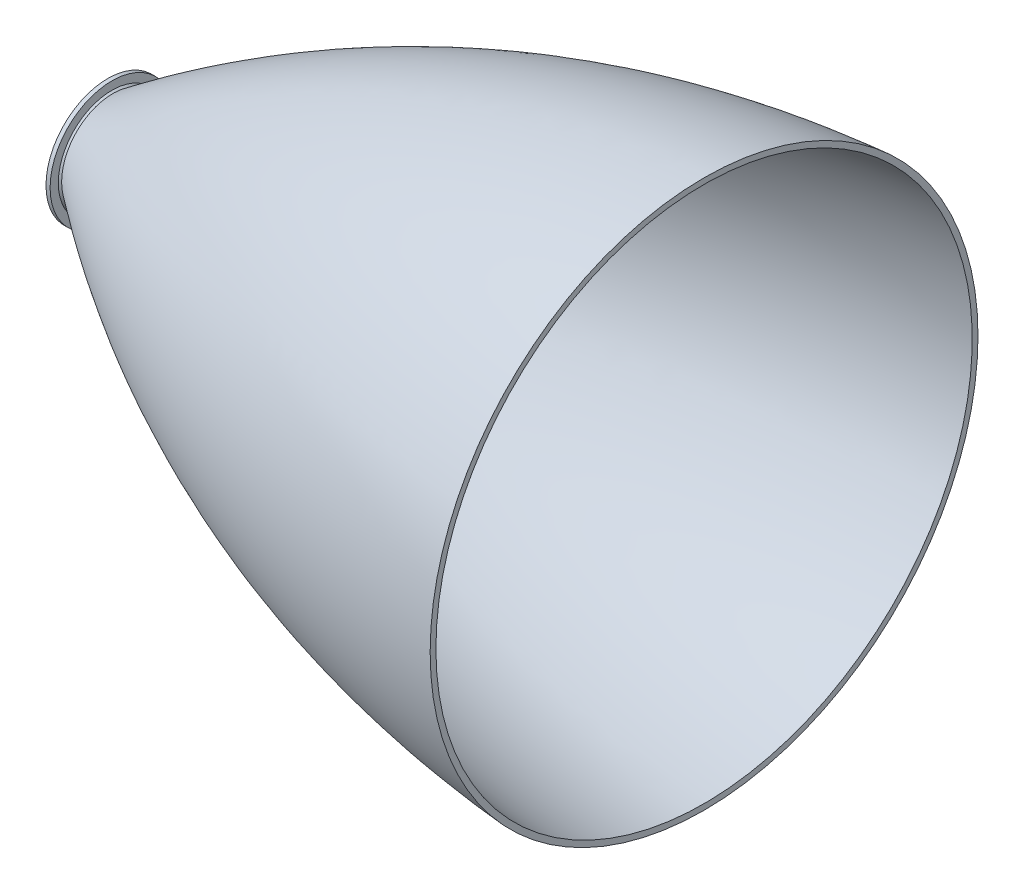
ISO-10303-21;
HEADER;
FILE_DESCRIPTION(('STEP AP214'),'2;1');
FILE_NAME('part.step','',(''),(''),'','','');
FILE_SCHEMA(('AUTOMOTIVE_DESIGN { 1 0 10303 214 1 1 1 1 }'));
ENDSEC;
DATA;
#1=APPLICATION_CONTEXT('core data for automotive mechanical design processes');
#2=APPLICATION_PROTOCOL_DEFINITION('international standard','automotive_design',2000,#1);
#3=PRODUCT_CONTEXT('',#1,'mechanical');
#4=PRODUCT('Part','Part','',(#3));
#5=PRODUCT_RELATED_PRODUCT_CATEGORY('part','',(#4));
#6=PRODUCT_DEFINITION_FORMATION('','',#4);
#7=PRODUCT_DEFINITION_CONTEXT('part definition',#1,'design');
#8=PRODUCT_DEFINITION('design','',#6,#7);
#9=PRODUCT_DEFINITION_SHAPE('','',#8);
#10=(LENGTH_UNIT() NAMED_UNIT(*) SI_UNIT(.MILLI.,.METRE.));
#11=(NAMED_UNIT(*) PLANE_ANGLE_UNIT() SI_UNIT($,.RADIAN.));
#12=(NAMED_UNIT(*) SI_UNIT($,.STERADIAN.) SOLID_ANGLE_UNIT());
#13=UNCERTAINTY_MEASURE_WITH_UNIT(LENGTH_MEASURE(1.E-05),#10,'distance_accuracy_value','');
#14=(GEOMETRIC_REPRESENTATION_CONTEXT(3) GLOBAL_UNCERTAINTY_ASSIGNED_CONTEXT((#13)) GLOBAL_UNIT_ASSIGNED_CONTEXT((#10,
#11,#12)) REPRESENTATION_CONTEXT('',''));
#15=CARTESIAN_POINT('',(0.,0.,0.));
#16=DIRECTION('',(0.,0.,1.));
#17=DIRECTION('',(1.,0.,0.));
#18=AXIS2_PLACEMENT_3D('',#15,#16,#17);
#19=CARTESIAN_POINT('',(-1.27,0.,0.));
#20=DIRECTION('',(-1.,0.,0.));
#21=DIRECTION('',(0.,0.,1.));
#22=AXIS2_PLACEMENT_3D('',#19,#20,#21);
#23=CYLINDRICAL_SURFACE('',#22,95.5048016460805);
#24=CARTESIAN_POINT('',(-1.27,0.,0.));
#25=DIRECTION('',(-1.,0.,0.));
#26=DIRECTION('',(0.,0.,1.));
#27=AXIS2_PLACEMENT_3D('',#24,#25,#26);
#28=CIRCLE('',#27,95.5048016460805);
#29=CARTESIAN_POINT('',(-1.27000000000067,0.,95.5048016460806));
#30=VERTEX_POINT('',#29);
#31=EDGE_CURVE('E11',#30,#30,#28,.T.);
#32=ORIENTED_EDGE('',*,*,#31,.T.);
#33=EDGE_LOOP('',(#32));
#34=FACE_BOUND('',#33,.T.);
#35=CARTESIAN_POINT('',(-7.62,0.,0.));
#36=DIRECTION('',(-1.,0.,0.));
#37=DIRECTION('',(0.,0.,1.));
#38=AXIS2_PLACEMENT_3D('',#35,#36,#37);
#39=CIRCLE('',#38,95.5048016460805);
#40=CARTESIAN_POINT('',(-7.62000000000067,0.,95.5048016460805));
#41=VERTEX_POINT('',#40);
#42=EDGE_CURVE('E50',#41,#41,#39,.T.);
#43=ORIENTED_EDGE('',*,*,#42,.F.);
#44=EDGE_LOOP('',(#43));
#45=FACE_BOUND('',#44,.T.);
#46=ADVANCED_FACE('F47',(#34,#45),#23,.T.);
#47=CARTESIAN_POINT('',(-1.27,0.,0.));
#48=DIRECTION('',(-1.,0.,0.));
#49=DIRECTION('',(0.,0.,1.));
#50=AXIS2_PLACEMENT_3D('',#47,#48,#49);
#51=PLANE('',#50);
#52=CARTESIAN_POINT('',(-1.27,0.,0.));
#53=DIRECTION('',(-1.,0.,0.));
#54=DIRECTION('',(0.,0.,1.));
#55=AXIS2_PLACEMENT_3D('',#52,#53,#54);
#56=CIRCLE('',#55,82.8048016460804);
#57=CARTESIAN_POINT('',(-1.27000000000058,0.,82.8048016460805));
#58=VERTEX_POINT('',#57);
#59=EDGE_CURVE('E57',#58,#58,#56,.T.);
#60=ORIENTED_EDGE('',*,*,#59,.T.);
#61=EDGE_LOOP('',(#60));
#62=FACE_BOUND('',#61,.T.);
#63=ORIENTED_EDGE('',*,*,#31,.F.);
#64=EDGE_LOOP('',(#63));
#65=FACE_BOUND('',#64,.T.);
#66=ADVANCED_FACE('F65',(#62,#65),#51,.F.);
#67=CARTESIAN_POINT('',(-7.62,0.,0.));
#68=DIRECTION('',(-1.,0.,0.));
#69=DIRECTION('',(0.,0.,1.));
#70=AXIS2_PLACEMENT_3D('',#67,#68,#69);
#71=PLANE('',#70);
#72=CARTESIAN_POINT('',(-7.62,0.,0.));
#73=DIRECTION('',(-1.,0.,0.));
#74=DIRECTION('',(0.,0.,1.));
#75=AXIS2_PLACEMENT_3D('',#72,#73,#74);
#76=CIRCLE('',#75,82.8048016460804);
#77=CARTESIAN_POINT('',(-7.62000000000058,0.,82.8048016460804));
#78=VERTEX_POINT('',#77);
#79=EDGE_CURVE('E59',#78,#78,#76,.T.);
#80=ORIENTED_EDGE('',*,*,#79,.F.);
#81=EDGE_LOOP('',(#80));
#82=FACE_BOUND('',#81,.T.);
#83=ORIENTED_EDGE('',*,*,#42,.T.);
#84=EDGE_LOOP('',(#83));
#85=FACE_BOUND('',#84,.T.);
#86=ADVANCED_FACE('F71',(#82,#85),#71,.T.);
#87=CARTESIAN_POINT('',(-1.27,0.,0.));
#88=DIRECTION('',(-1.,0.,0.));
#89=DIRECTION('',(0.,0.,1.));
#90=AXIS2_PLACEMENT_3D('',#87,#88,#89);
#91=CYLINDRICAL_SURFACE('',#90,82.8048016460804);
#92=ORIENTED_EDGE('',*,*,#59,.F.);
#93=EDGE_LOOP('',(#92));
#94=FACE_BOUND('',#93,.T.);
#95=ORIENTED_EDGE('',*,*,#79,.T.);
#96=EDGE_LOOP('',(#95));
#97=FACE_BOUND('',#96,.T.);
#98=ADVANCED_FACE('F68',(#94,#97),#91,.F.);
#99=CLOSED_SHELL('',(#46,#66,#86,#98));
#100=MANIFOLD_SOLID_BREP('B2',#99);
#101=CARTESIAN_POINT('',(-4.74584123450109E-13,78.9939999999998,0.));
#102=CARTESIAN_POINT('',(-192.730394607075,176.706088879271,0.));
#103=CARTESIAN_POINT('',(-412.824178467712,153.699870936221,0.));
#104=B_SPLINE_CURVE_WITH_KNOTS('',2,(#101,#102,#103),.UNSPECIFIED.,.F.,.F.,(3,3),(0.,1.),.UNSPECIFIED.);
#105=CARTESIAN_POINT('',(-1229.82823928785,0.,0.));
#106=DIRECTION('',(-1.,0.,0.));
#107=AXIS1_PLACEMENT('',#105,#106);
#108=SURFACE_OF_REVOLUTION('',#104,#107);
#109=CARTESIAN_POINT('',(-4.44089209850063E-13,0.,0.));
#110=DIRECTION('',(-1.,0.,0.));
#111=DIRECTION('',(0.,0.,1.));
#112=AXIS2_PLACEMENT_3D('',#109,#110,#111);
#113=CIRCLE('',#112,78.9939999999998);
#114=CARTESIAN_POINT('',(-4.44089209850063E-13,0.,78.9939999999998));
#115=VERTEX_POINT('',#114);
#116=EDGE_CURVE('E46',#115,#115,#113,.T.);
#117=ORIENTED_EDGE('',*,*,#116,.T.);
#118=EDGE_LOOP('',(#117));
#119=FACE_BOUND('',#118,.T.);
#120=CARTESIAN_POINT('',(-7.61999999999996,0.,0.));
#121=DIRECTION('',(-1.,0.,0.));
#122=DIRECTION('',(0.,0.,1.));
#123=AXIS2_PLACEMENT_3D('',#120,#121,#122);
#124=CIRCLE('',#123,82.8048016460804);
#125=CARTESIAN_POINT('',(-7.61999999999996,0.,82.8048016460804));
#126=VERTEX_POINT('',#125);
#127=EDGE_CURVE('E134',#126,#126,#124,.T.);
#128=ORIENTED_EDGE('',*,*,#127,.F.);
#129=EDGE_LOOP('',(#128));
#130=FACE_BOUND('',#129,.T.);
#131=ADVANCED_FACE('F109',(#119,#130),#108,.T.);
#132=CARTESIAN_POINT('',(0.,70.1039999999998,0.));
#133=CARTESIAN_POINT('',(-195.449728046968,157.410787997723,0.));
#134=CARTESIAN_POINT('',(-412.824178467712,144.809870936221,0.));
#135=B_SPLINE_CURVE_WITH_KNOTS('',2,(#132,#133,#134),.UNSPECIFIED.,.F.,.F.,(3,3),(0.,1.),.UNSPECIFIED.);
#136=CARTESIAN_POINT('',(-1229.82823928785,0.,0.));
#137=DIRECTION('',(-1.,0.,0.));
#138=AXIS1_PLACEMENT('',#136,#137);
#139=SURFACE_OF_REVOLUTION('',#135,#138);
#140=CARTESIAN_POINT('',(0.,0.,0.));
#141=DIRECTION('',(-1.,0.,0.));
#142=DIRECTION('',(0.,0.,1.));
#143=AXIS2_PLACEMENT_3D('',#140,#141,#142);
#144=CIRCLE('',#143,70.1039999999998);
#145=CARTESIAN_POINT('',(0.,0.,70.1039999999998));
#146=VERTEX_POINT('',#145);
#147=EDGE_CURVE('E119',#146,#146,#144,.T.);
#148=ORIENTED_EDGE('',*,*,#147,.F.);
#149=EDGE_LOOP('',(#148));
#150=FACE_BOUND('',#149,.T.);
#151=CARTESIAN_POINT('',(-7.61999999999996,0.,0.));
#152=DIRECTION('',(-1.,0.,0.));
#153=DIRECTION('',(0.,0.,1.));
#154=AXIS2_PLACEMENT_3D('',#151,#152,#153);
#155=CIRCLE('',#154,73.4662351266418);
#156=CARTESIAN_POINT('',(-7.61999999999996,0.,73.4662351266418));
#157=VERTEX_POINT('',#156);
#158=EDGE_CURVE('E114',#157,#157,#155,.T.);
#159=ORIENTED_EDGE('',*,*,#158,.T.);
#160=EDGE_LOOP('',(#159));
#161=FACE_BOUND('',#160,.T.);
#162=ADVANCED_FACE('F154',(#150,#161),#139,.F.);
#163=CARTESIAN_POINT('',(-4.74584123450109E-13,78.9939999999998,0.));
#164=CARTESIAN_POINT('',(408.290095894031,383.612870220391,0.));
#165=CARTESIAN_POINT('',(914.4,423.545,0.));
#166=B_SPLINE_CURVE_WITH_KNOTS('',2,(#163,#164,#165),.UNSPECIFIED.,.F.,.F.,(3,3),(0.,1.),.UNSPECIFIED.);
#167=CARTESIAN_POINT('',(-1229.82823928785,0.,0.));
#168=DIRECTION('',(-1.,0.,0.));
#169=AXIS1_PLACEMENT('',#167,#168);
#170=SURFACE_OF_REVOLUTION('',#166,#169);
#171=CARTESIAN_POINT('',(914.4,0.,0.));
#172=DIRECTION('',(-1.,0.,0.));
#173=DIRECTION('',(0.,0.,1.));
#174=AXIS2_PLACEMENT_3D('',#171,#172,#173);
#175=CIRCLE('',#174,423.545);
#176=CARTESIAN_POINT('',(914.4,0.,423.545));
#177=VERTEX_POINT('',#176);
#178=EDGE_CURVE('E130',#177,#177,#175,.T.);
#179=ORIENTED_EDGE('',*,*,#178,.T.);
#180=EDGE_LOOP('',(#179));
#181=FACE_BOUND('',#180,.T.);
#182=ORIENTED_EDGE('',*,*,#116,.F.);
#183=EDGE_LOOP('',(#182));
#184=FACE_BOUND('',#183,.T.);
#185=ADVANCED_FACE('F111',(#181,#184),#170,.F.);
#186=CARTESIAN_POINT('',(0.,70.1039999999998,0.));
#187=CARTESIAN_POINT('',(420.167251453263,366.631175917664,0.));
#188=CARTESIAN_POINT('',(914.4,414.655,0.));
#189=B_SPLINE_CURVE_WITH_KNOTS('',2,(#186,#187,#188),.UNSPECIFIED.,.F.,.F.,(3,3),(0.,1.),.UNSPECIFIED.);
#190=CARTESIAN_POINT('',(-1229.82823928785,0.,0.));
#191=DIRECTION('',(-1.,0.,0.));
#192=AXIS1_PLACEMENT('',#190,#191);
#193=SURFACE_OF_REVOLUTION('',#189,#192);
#194=CARTESIAN_POINT('',(914.4,0.,0.));
#195=DIRECTION('',(-1.,0.,0.));
#196=DIRECTION('',(0.,0.,1.));
#197=AXIS2_PLACEMENT_3D('',#194,#195,#196);
#198=CIRCLE('',#197,414.655);
#199=CARTESIAN_POINT('',(914.4,0.,414.655));
#200=VERTEX_POINT('',#199);
#201=EDGE_CURVE('E124',#200,#200,#198,.T.);
#202=ORIENTED_EDGE('',*,*,#201,.F.);
#203=EDGE_LOOP('',(#202));
#204=FACE_BOUND('',#203,.T.);
#205=ORIENTED_EDGE('',*,*,#147,.T.);
#206=EDGE_LOOP('',(#205));
#207=FACE_BOUND('',#206,.T.);
#208=ADVANCED_FACE('F147',(#204,#207),#193,.T.);
#209=CARTESIAN_POINT('',(914.4,3.42583104741482E-11,0.));
#210=DIRECTION('',(1.,0.,0.));
#211=DIRECTION('',(0.,0.,-1.));
#212=AXIS2_PLACEMENT_3D('',#209,#210,#211);
#213=PLANE('',#212);
#214=ORIENTED_EDGE('',*,*,#201,.T.);
#215=EDGE_LOOP('',(#214));
#216=FACE_BOUND('',#215,.T.);
#217=ORIENTED_EDGE('',*,*,#178,.F.);
#218=EDGE_LOOP('',(#217));
#219=FACE_BOUND('',#218,.T.);
#220=ADVANCED_FACE('F151',(#216,#219),#213,.T.);
#221=CARTESIAN_POINT('',(-7.62,0.,0.));
#222=DIRECTION('',(-1.,0.,0.));
#223=DIRECTION('',(0.,0.,1.));
#224=AXIS2_PLACEMENT_3D('',#221,#222,#223);
#225=PLANE('',#224);
#226=ORIENTED_EDGE('',*,*,#158,.F.);
#227=EDGE_LOOP('',(#226));
#228=FACE_BOUND('',#227,.T.);
#229=ORIENTED_EDGE('',*,*,#127,.T.);
#230=EDGE_LOOP('',(#229));
#231=FACE_BOUND('',#230,.T.);
#232=ADVANCED_FACE('F180',(#228,#231),#225,.T.);
#233=CLOSED_SHELL('',(#131,#162,#185,#208,#220,#232));
#234=MANIFOLD_SOLID_BREP('B6',#233);
#235=ADVANCED_BREP_SHAPE_REPRESENTATION('',(#18,#100,#234),#14);
#236=SHAPE_DEFINITION_REPRESENTATION(#9,#235);
ENDSEC;
END-ISO-10303-21;
